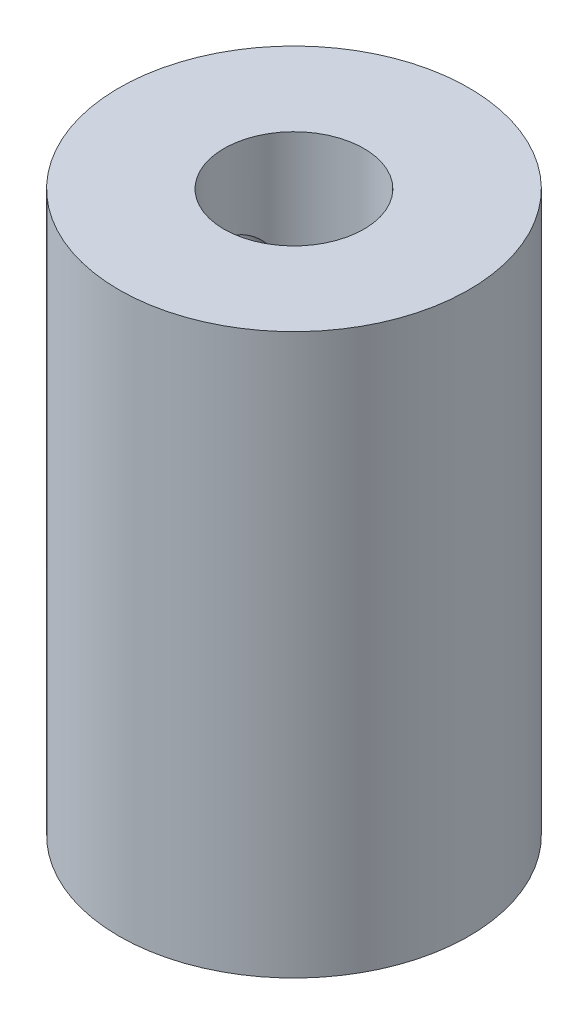
ISO-10303-21;
HEADER;
FILE_DESCRIPTION(('STEP AP214'),'2;1');
FILE_NAME('part.step','',(''),(''),'','','');
FILE_SCHEMA(('AUTOMOTIVE_DESIGN { 1 0 10303 214 1 1 1 1 }'));
ENDSEC;
DATA;
#1=APPLICATION_CONTEXT('core data for automotive mechanical design processes');
#2=APPLICATION_PROTOCOL_DEFINITION('international standard','automotive_design',2000,#1);
#3=PRODUCT_CONTEXT('',#1,'mechanical');
#4=PRODUCT('Part','Part','',(#3));
#5=PRODUCT_RELATED_PRODUCT_CATEGORY('part','',(#4));
#6=PRODUCT_DEFINITION_FORMATION('','',#4);
#7=PRODUCT_DEFINITION_CONTEXT('part definition',#1,'design');
#8=PRODUCT_DEFINITION('design','',#6,#7);
#9=PRODUCT_DEFINITION_SHAPE('','',#8);
#10=(LENGTH_UNIT() NAMED_UNIT(*) SI_UNIT(.MILLI.,.METRE.));
#11=(NAMED_UNIT(*) PLANE_ANGLE_UNIT() SI_UNIT($,.RADIAN.));
#12=(NAMED_UNIT(*) SI_UNIT($,.STERADIAN.) SOLID_ANGLE_UNIT());
#13=UNCERTAINTY_MEASURE_WITH_UNIT(LENGTH_MEASURE(1.E-05),#10,'distance_accuracy_value','');
#14=(GEOMETRIC_REPRESENTATION_CONTEXT(3) GLOBAL_UNCERTAINTY_ASSIGNED_CONTEXT((#13)) GLOBAL_UNIT_ASSIGNED_CONTEXT((#10,
#11,#12)) REPRESENTATION_CONTEXT('',''));
#15=CARTESIAN_POINT('',(0.,0.,0.));
#16=DIRECTION('',(0.,0.,1.));
#17=DIRECTION('',(1.,0.,0.));
#18=AXIS2_PLACEMENT_3D('',#15,#16,#17);
#19=CARTESIAN_POINT('',(0.,0.,0.));
#20=DIRECTION('',(0.,1.,0.));
#21=DIRECTION('',(0.,0.,1.));
#22=AXIS2_PLACEMENT_3D('',#19,#20,#21);
#23=PLANE('',#22);
#24=CARTESIAN_POINT('',(0.,0.,0.));
#25=DIRECTION('',(0.,1.,0.));
#26=DIRECTION('',(0.,0.,1.));
#27=AXIS2_PLACEMENT_3D('',#24,#25,#26);
#28=CIRCLE('',#27,5.);
#29=CARTESIAN_POINT('',(0.,0.,5.));
#30=VERTEX_POINT('',#29);
#31=EDGE_CURVE('E10',#30,#30,#28,.T.);
#32=ORIENTED_EDGE('',*,*,#31,.F.);
#33=EDGE_LOOP('',(#32));
#34=FACE_BOUND('',#33,.T.);
#35=CARTESIAN_POINT('',(0.,0.,0.));
#36=DIRECTION('',(0.,1.,0.));
#37=DIRECTION('',(0.,0.,1.));
#38=AXIS2_PLACEMENT_3D('',#35,#36,#37);
#39=CIRCLE('',#38,2.1);
#40=CARTESIAN_POINT('',(0.,0.,2.1));
#41=VERTEX_POINT('',#40);
#42=EDGE_CURVE('E43',#41,#41,#39,.T.);
#43=ORIENTED_EDGE('',*,*,#42,.T.);
#44=EDGE_LOOP('',(#43));
#45=FACE_BOUND('',#44,.T.);
#46=ADVANCED_FACE('F35',(#34,#45),#23,.F.);
#47=CARTESIAN_POINT('',(0.,8.,0.));
#48=DIRECTION('',(0.,-1.,0.));
#49=DIRECTION('',(0.,0.,-1.));
#50=AXIS2_PLACEMENT_3D('',#47,#48,#49);
#51=CYLINDRICAL_SURFACE('',#50,5.);
#52=CARTESIAN_POINT('',(-4.84122918275927,12.5,1.24999999999999));
#53=CARTESIAN_POINT('',(-4.84123050042654,12.4309746245377,1.24999803929588));
#54=CARTESIAN_POINT('',(-4.84272153006957,12.361927550661,1.24426312274865));
#55=CARTESIAN_POINT('',(-4.84850930996624,12.225816210913,1.22151156273206));
#56=CARTESIAN_POINT('',(-4.85280769310907,12.1587531227658,1.20448835337109));
#57=CARTESIAN_POINT('',(-4.86369362297984,12.0285982309065,1.15974559981597));
#58=CARTESIAN_POINT('',(-4.87027821345205,11.9655014223072,1.13203986392723));
#59=CARTESIAN_POINT('',(-4.88499096014404,11.84484457373,1.0667605706307));
#60=CARTESIAN_POINT('',(-4.89311918189251,11.7872847689599,1.02918659428034));
#61=CARTESIAN_POINT('',(-4.91020358177806,11.6780691773689,0.944354213655933));
#62=CARTESIAN_POINT('',(-4.91917298811515,11.626553199825,0.89691844385202));
#63=CARTESIAN_POINT('',(-4.93681437757649,11.5321193028198,0.794091032050328));
#64=CARTESIAN_POINT('',(-4.94548633283195,11.4892021871891,0.73869864709015));
#65=CARTESIAN_POINT('',(-4.96170207760291,11.4126122661844,0.620572600539473));
#66=CARTESIAN_POINT('',(-4.96922843700296,11.3790768059193,0.557747288097556));
#67=CARTESIAN_POINT('',(-4.98215405962992,11.3230951779235,0.427131592146378));
#68=CARTESIAN_POINT('',(-4.98755363667172,11.3006473740423,0.359341942895968));
#69=CARTESIAN_POINT('',(-4.9955237942409,11.2679260827107,0.222179379377079));
#70=CARTESIAN_POINT('',(-4.99814946922157,11.2574151778367,0.152866359774487));
#71=CARTESIAN_POINT('',(-5.00046797053649,11.2481208103622,0.0134144096313842));
#72=CARTESIAN_POINT('',(-5.00016123048352,11.2493356138952,-0.0567243972690344));
#73=CARTESIAN_POINT('',(-4.99669047476767,11.2632874251251,-0.194190308965483));
#74=CARTESIAN_POINT('',(-4.99359001170437,11.2757681625269,-0.261545269501333));
#75=CARTESIAN_POINT('',(-4.98495418262427,11.3114856350243,-0.393172809267106));
#76=CARTESIAN_POINT('',(-4.9794186869922,11.3347229426887,-0.457445224213045));
#77=CARTESIAN_POINT('',(-4.96643754850448,11.3915012853435,-0.581758379377256));
#78=CARTESIAN_POINT('',(-4.95897509847527,11.4251335223309,-0.641755637208128));
#79=CARTESIAN_POINT('',(-4.94294951904825,11.5016778395581,-0.755344527925607));
#80=CARTESIAN_POINT('',(-4.93438619826245,11.5445915342803,-0.808935043856878));
#81=CARTESIAN_POINT('',(-4.9168185688476,11.6398543709912,-0.90971754385619));
#82=CARTESIAN_POINT('',(-4.90780859762959,11.6924274461739,-0.956697098843993));
#83=CARTESIAN_POINT('',(-4.89057521758353,11.8047999867701,-1.04122046995377));
#84=CARTESIAN_POINT('',(-4.88235184552985,11.8645997897455,-1.07876384505751));
#85=CARTESIAN_POINT('',(-4.86760248415824,11.9901450170745,-1.14348516127824));
#86=CARTESIAN_POINT('',(-4.8610849186286,12.0559178651566,-1.17061195871311));
#87=CARTESIAN_POINT('',(-4.85059320069979,12.1912927340382,-1.21335702579542));
#88=CARTESIAN_POINT('',(-4.84661850405109,12.2608939319916,-1.22897775819113));
#89=CARTESIAN_POINT('',(-4.84177678019571,12.3999797507616,-1.24791481933258));
#90=CARTESIAN_POINT('',(-4.84083044546824,12.4694188966648,-1.25154523695981));
#91=CARTESIAN_POINT('',(-4.8419367174052,12.6079109682891,-1.24725849525777));
#92=CARTESIAN_POINT('',(-4.84398904800633,12.6769639289756,-1.23934239892439));
#93=CARTESIAN_POINT('',(-4.8507854097728,12.8115571324774,-1.21246273196882));
#94=CARTESIAN_POINT('',(-4.85548485117188,12.8771363632854,-1.19368203414087));
#95=CARTESIAN_POINT('',(-4.86700359135481,13.0042157289258,-1.1458090408353));
#96=CARTESIAN_POINT('',(-4.87382314124307,13.0657153795277,-1.11671552385627));
#97=CARTESIAN_POINT('',(-4.88898068546631,13.1842206389337,-1.04838533396827));
#98=CARTESIAN_POINT('',(-4.89734584303321,13.2411144200215,-1.00896087691781));
#99=CARTESIAN_POINT('',(-4.91458541535858,13.3475941814007,-0.921325366168063));
#100=CARTESIAN_POINT('',(-4.92345991364235,13.397178958325,-0.873112868506793));
#101=CARTESIAN_POINT('',(-4.94098701515803,13.4889055212855,-0.767828401230901));
#102=CARTESIAN_POINT('',(-4.94962851030918,13.5308300312744,-0.710564940664485));
#103=CARTESIAN_POINT('',(-4.96548608306867,13.6044679334756,-0.58962835336834));
#104=CARTESIAN_POINT('',(-4.9727022350198,13.6361818583041,-0.525955561196985));
#105=CARTESIAN_POINT('',(-4.98485057869157,13.688223017264,-0.394447752163859));
#106=CARTESIAN_POINT('',(-4.98979915011205,13.7086321421895,-0.326646726284848));
#107=CARTESIAN_POINT('',(-4.99692646697894,13.7377301673042,-0.188437200398507));
#108=CARTESIAN_POINT('',(-4.99910574696704,13.7464213293695,-0.118029206301552));
#109=CARTESIAN_POINT('',(-5.00042711761014,13.7517094869694,0.0213544080541591));
#110=CARTESIAN_POINT('',(-4.9996497360001,13.7486271363692,0.0903172837075422));
#111=CARTESIAN_POINT('',(-4.99532370571779,13.7311902158821,0.226709370518425));
#112=CARTESIAN_POINT('',(-4.99177513946369,13.7168359812336,0.294138627226108));
#113=CARTESIAN_POINT('',(-4.98231791067453,13.6774347252863,0.425213794556019));
#114=CARTESIAN_POINT('',(-4.97642205628333,13.6524456833567,0.488878118226273));
#115=CARTESIAN_POINT('',(-4.9628911114173,13.5925367762258,0.611146316301834));
#116=CARTESIAN_POINT('',(-4.9552558017217,13.557615659163,0.669749551581312));
#117=CARTESIAN_POINT('',(-4.93884062101666,13.4778559575037,0.781752410529871));
#118=CARTESIAN_POINT('',(-4.93003771182014,13.4327998213658,0.834993735375727));
#119=CARTESIAN_POINT('',(-4.91238311316553,13.3344714350327,0.933268775339065));
#120=CARTESIAN_POINT('',(-4.90353141190695,13.2811971048776,0.978300406335232));
#121=CARTESIAN_POINT('',(-4.88659344825685,13.1667482322483,1.05970253309903));
#122=CARTESIAN_POINT('',(-4.87852454662356,13.1054448457342,1.09589577430818));
#123=CARTESIAN_POINT('',(-4.8642994443827,12.9774306375966,1.15740862076958));
#124=CARTESIAN_POINT('',(-4.85814185308379,12.9107237923666,1.18273613719964));
#125=CARTESIAN_POINT('',(-4.84939885924729,12.7867787352166,1.21802816070679));
#126=CARTESIAN_POINT('',(-4.84635828750683,12.7301335445202,1.22999146324422));
#127=CARTESIAN_POINT('',(-4.84227298231965,12.61566391375,1.24597786571658));
#128=CARTESIAN_POINT('',(-4.84122807862454,12.5578395746937,1.25000164296522));
#129=CARTESIAN_POINT('',(-4.84122918275927,12.5,1.24999999999999));
#130=B_SPLINE_CURVE_WITH_KNOTS('',3,(#52,#53,#54,#55,#56,#57,#58,#59,#60,#61,#62,#63,#64,#65,
#66,#67,#68,#69,#70,#71,#72,#73,#74,#75,#76,#77,#78,#79,#80,#81,#82,#83,#84,#85,#86,#87,#88,#89,
#90,#91,#92,#93,#94,#95,#96,#97,#98,#99,#100,#101,#102,#103,#104,#105,#106,#107,#108,#109,#110,
#111,#112,#113,#114,#115,#116,#117,#118,#119,#120,#121,#122,#123,#124,#125,#126,#127,#128,#129),
.UNSPECIFIED.,.T.,.F.,(4,2,2,2,2,2,2,2,2,2,2,2,2,2,2,2,2,2,2,2,2,2,2,2,2,2,2,2,2,2,2,2,2,2,2,2,
2,2,4),(0.,0.206863720868068,0.413847870714331,0.620565363583007,0.827291633777387,
1.03811977096488,1.24896760739933,1.46275748198959,1.67651579923545,1.88594375497672,
2.09534074333009,2.30009131344472,2.50485278362392,2.71146437127221,2.91811192734455,
3.13035233285954,3.34260265599899,3.55588216004199,3.76911600064772,3.97671787380857,
4.18430063591899,4.38848702504601,4.59269760710706,4.80091422929576,5.0091650944252,
5.22262665482657,5.43607707859774,5.64796036403462,5.85980274454516,6.06591723063725,
6.27202558688487,6.47702438279852,6.68204902869033,6.89198548291032,7.10197515782751,
7.31588238642335,7.52963360683306,7.70298913588661,7.87632987549756),.UNSPECIFIED.);
#131=CARTESIAN_POINT('',(-4.84122918275927,12.5,1.24999999999999));
#132=VERTEX_POINT('',#131);
#133=EDGE_CURVE('E112',#132,#132,#130,.T.);
#134=ORIENTED_EDGE('',*,*,#133,.T.);
#135=EDGE_LOOP('',(#134));
#136=FACE_BOUND('',#135,.T.);
#137=CARTESIAN_POINT('',(-4.84122918275927,3.5,1.24999999999999));
#138=CARTESIAN_POINT('',(-4.84123050042654,3.4309746245377,1.24999803929588));
#139=CARTESIAN_POINT('',(-4.84272153006957,3.361927550661,1.24426312274865));
#140=CARTESIAN_POINT('',(-4.84850930996624,3.22581621091298,1.22151156273206));
#141=CARTESIAN_POINT('',(-4.85280769310907,3.15875312276584,1.20448835337109));
#142=CARTESIAN_POINT('',(-4.86369362297984,3.02859823090648,1.15974559981597));
#143=CARTESIAN_POINT('',(-4.87027821345204,2.96550142230717,1.13203986392723));
#144=CARTESIAN_POINT('',(-4.88499096014404,2.84484457373004,1.0667605706307));
#145=CARTESIAN_POINT('',(-4.89311918189251,2.78728476895989,1.02918659428034));
#146=CARTESIAN_POINT('',(-4.91020358177806,2.6780691773689,0.944354213655933));
#147=CARTESIAN_POINT('',(-4.91917298811515,2.62655319982498,0.896918443852021));
#148=CARTESIAN_POINT('',(-4.93681437757649,2.53211930281983,0.794091032050329));
#149=CARTESIAN_POINT('',(-4.94548633283195,2.48920218718913,0.738698647090151));
#150=CARTESIAN_POINT('',(-4.96170207760291,2.41261226618437,0.620572600539475));
#151=CARTESIAN_POINT('',(-4.96922843700296,2.37907680591927,0.557747288097558));
#152=CARTESIAN_POINT('',(-4.98215405962992,2.32309517792346,0.42713159214638));
#153=CARTESIAN_POINT('',(-4.98755363667172,2.30064737404225,0.359341942895969));
#154=CARTESIAN_POINT('',(-4.9955237942409,2.26792608271071,0.22217937937708));
#155=CARTESIAN_POINT('',(-4.99814946922157,2.25741517783672,0.152866359774488));
#156=CARTESIAN_POINT('',(-5.00046797053649,2.24812081036223,0.0134144096313855));
#157=CARTESIAN_POINT('',(-5.00016123048352,2.24933561389521,-0.056724397269033));
#158=CARTESIAN_POINT('',(-4.99669047476767,2.26328742512508,-0.194190308965482));
#159=CARTESIAN_POINT('',(-4.99359001170437,2.27576816252693,-0.261545269501331));
#160=CARTESIAN_POINT('',(-4.98495418262427,2.31148563502426,-0.393172809267104));
#161=CARTESIAN_POINT('',(-4.9794186869922,2.33472294268871,-0.457445224213044));
#162=CARTESIAN_POINT('',(-4.96643754850448,2.39150128534354,-0.581758379377254));
#163=CARTESIAN_POINT('',(-4.95897509847527,2.42513352233088,-0.641755637208126));
#164=CARTESIAN_POINT('',(-4.94294951904825,2.50167783955813,-0.755344527925606));
#165=CARTESIAN_POINT('',(-4.93438619826245,2.54459153428031,-0.808935043856877));
#166=CARTESIAN_POINT('',(-4.9168185688476,2.63985437099119,-0.909717543856189));
#167=CARTESIAN_POINT('',(-4.90780859762959,2.69242744617389,-0.956697098843993));
#168=CARTESIAN_POINT('',(-4.89057521758353,2.80479998677013,-1.04122046995377));
#169=CARTESIAN_POINT('',(-4.88235184552985,2.8645997897455,-1.07876384505751));
#170=CARTESIAN_POINT('',(-4.86760248415824,2.99014501707449,-1.14348516127824));
#171=CARTESIAN_POINT('',(-4.8610849186286,3.0559178651566,-1.17061195871311));
#172=CARTESIAN_POINT('',(-4.85059320069979,3.19129273403823,-1.21335702579542));
#173=CARTESIAN_POINT('',(-4.84661850405109,3.26089393199157,-1.22897775819113));
#174=CARTESIAN_POINT('',(-4.84177678019571,3.39997975076156,-1.24791481933258));
#175=CARTESIAN_POINT('',(-4.84083044546824,3.46941889666481,-1.25154523695981));
#176=CARTESIAN_POINT('',(-4.8419367174052,3.60791096828908,-1.24725849525777));
#177=CARTESIAN_POINT('',(-4.84398904800633,3.67696392897562,-1.23934239892439));
#178=CARTESIAN_POINT('',(-4.8507854097728,3.81155713247735,-1.21246273196882));
#179=CARTESIAN_POINT('',(-4.85548485117188,3.87713636328542,-1.19368203414086));
#180=CARTESIAN_POINT('',(-4.86700359135481,4.00421572892584,-1.1458090408353));
#181=CARTESIAN_POINT('',(-4.87382314124307,4.06571537952767,-1.11671552385627));
#182=CARTESIAN_POINT('',(-4.88898068546631,4.18422063893367,-1.04838533396827));
#183=CARTESIAN_POINT('',(-4.89734584303321,4.24111442002155,-1.00896087691781));
#184=CARTESIAN_POINT('',(-4.91458541535858,4.34759418140067,-0.921325366168063));
#185=CARTESIAN_POINT('',(-4.92345991364235,4.39717895832503,-0.873112868506793));
#186=CARTESIAN_POINT('',(-4.94098701515803,4.48890552128547,-0.767828401230902));
#187=CARTESIAN_POINT('',(-4.94962851030918,4.5308300312744,-0.710564940664485));
#188=CARTESIAN_POINT('',(-4.96548608306867,4.60446793347562,-0.58962835336834));
#189=CARTESIAN_POINT('',(-4.9727022350198,4.6361818583041,-0.525955561196985));
#190=CARTESIAN_POINT('',(-4.98485057869157,4.68822301726396,-0.394447752163859));
#191=CARTESIAN_POINT('',(-4.98979915011205,4.70863214218952,-0.326646726284848));
#192=CARTESIAN_POINT('',(-4.99692646697894,4.7377301673042,-0.188437200398507));
#193=CARTESIAN_POINT('',(-4.99910574696704,4.74642132936952,-0.118029206301552));
#194=CARTESIAN_POINT('',(-5.00042711761014,4.75170948696941,0.0213544080541592));
#195=CARTESIAN_POINT('',(-4.9996497360001,4.74862713636923,0.0903172837075423));
#196=CARTESIAN_POINT('',(-4.9953237057178,4.73119021588208,0.226709370518425));
#197=CARTESIAN_POINT('',(-4.99177513946369,4.71683598123361,0.294138627226108));
#198=CARTESIAN_POINT('',(-4.98231791067453,4.67743472528633,0.425213794556019));
#199=CARTESIAN_POINT('',(-4.97642205628333,4.65244568335671,0.488878118226273));
#200=CARTESIAN_POINT('',(-4.9628911114173,4.59253677622584,0.611146316301834));
#201=CARTESIAN_POINT('',(-4.9552558017217,4.55761565916304,0.669749551581312));
#202=CARTESIAN_POINT('',(-4.93884062101666,4.47785595750365,0.781752410529871));
#203=CARTESIAN_POINT('',(-4.93003771182014,4.43279982136577,0.834993735375727));
#204=CARTESIAN_POINT('',(-4.91238311316553,4.33447143503275,0.933268775339065));
#205=CARTESIAN_POINT('',(-4.90353141190695,4.28119710487761,0.978300406335233));
#206=CARTESIAN_POINT('',(-4.88659344825685,4.16674823224833,1.05970253309903));
#207=CARTESIAN_POINT('',(-4.87852454662356,4.10544484573421,1.09589577430818));
#208=CARTESIAN_POINT('',(-4.8642994443827,3.97743063759662,1.15740862076958));
#209=CARTESIAN_POINT('',(-4.85814185308379,3.91072379236657,1.18273613719964));
#210=CARTESIAN_POINT('',(-4.84939885924729,3.7867787352166,1.21802816070679));
#211=CARTESIAN_POINT('',(-4.84635828750683,3.73013354452017,1.22999146324422));
#212=CARTESIAN_POINT('',(-4.84227298231965,3.61566391375004,1.24597786571658));
#213=CARTESIAN_POINT('',(-4.84122807862454,3.55783957469367,1.25000164296523));
#214=CARTESIAN_POINT('',(-4.84122918275927,3.5,1.24999999999999));
#215=B_SPLINE_CURVE_WITH_KNOTS('',3,(#137,#138,#139,#140,#141,#142,#143,#144,#145,#146,#147,
#148,#149,#150,#151,#152,#153,#154,#155,#156,#157,#158,#159,#160,#161,#162,#163,#164,#165,#166,
#167,#168,#169,#170,#171,#172,#173,#174,#175,#176,#177,#178,#179,#180,#181,#182,#183,#184,#185,
#186,#187,#188,#189,#190,#191,#192,#193,#194,#195,#196,#197,#198,#199,#200,#201,#202,#203,#204,
#205,#206,#207,#208,#209,#210,#211,#212,#213,#214),.UNSPECIFIED.,.T.,.F.,(4,2,2,2,2,2,2,2,2,2,2,
2,2,2,2,2,2,2,2,2,2,2,2,2,2,2,2,2,2,2,2,2,2,2,2,2,2,2,4),(0.,0.206863720868067,
0.413847870714331,0.620565363583008,0.827291633777388,1.03811977096487,1.24896760739933,
1.46275748198959,1.67651579923545,1.88594375497672,2.09534074333009,2.30009131344472,
2.50485278362392,2.71146437127221,2.91811192734455,3.13035233285954,3.34260265599899,
3.55588216004199,3.76911600064772,3.97671787380856,4.18430063591899,4.38848702504601,
4.59269760710706,4.80091422929576,5.00916509442519,5.22262665482657,5.43607707859774,
5.64796036403462,5.85980274454516,6.06591723063725,6.27202558688487,6.47702438279852,
6.68204902869033,6.89198548291032,7.10197515782751,7.31588238642335,7.52963360683306,
7.70298913588661,7.87632987549756),.UNSPECIFIED.);
#216=CARTESIAN_POINT('',(-4.84122918275927,3.5,1.24999999999999));
#217=VERTEX_POINT('',#216);
#218=EDGE_CURVE('E60',#217,#217,#215,.T.);
#219=ORIENTED_EDGE('',*,*,#218,.T.);
#220=EDGE_LOOP('',(#219));
#221=FACE_BOUND('',#220,.T.);
#222=ORIENTED_EDGE('',*,*,#31,.T.);
#223=EDGE_LOOP('',(#222));
#224=FACE_BOUND('',#223,.T.);
#225=CARTESIAN_POINT('',(0.,16.,0.));
#226=DIRECTION('',(0.,1.,0.));
#227=DIRECTION('',(0.,0.,1.));
#228=AXIS2_PLACEMENT_3D('',#225,#226,#227);
#229=CIRCLE('',#228,5.);
#230=CARTESIAN_POINT('',(0.,16.,5.));
#231=VERTEX_POINT('',#230);
#232=EDGE_CURVE('E51',#231,#231,#229,.T.);
#233=ORIENTED_EDGE('',*,*,#232,.F.);
#234=EDGE_LOOP('',(#233));
#235=FACE_BOUND('',#234,.T.);
#236=ADVANCED_FACE('F37',(#136,#221,#224,#235),#51,.T.);
#237=CARTESIAN_POINT('',(0.,8.,0.));
#238=DIRECTION('',(0.,-1.,0.));
#239=DIRECTION('',(0.,0.,-1.));
#240=AXIS2_PLACEMENT_3D('',#237,#238,#239);
#241=CYLINDRICAL_SURFACE('',#240,2.1);
#242=CARTESIAN_POINT('',(-1.68745370306862,3.5,1.24999999999999));
#243=CARTESIAN_POINT('',(-1.68745034276093,3.43698076884238,1.25000239170536));
#244=CARTESIAN_POINT('',(-1.69103664835489,3.37397345633133,1.24520529451589));
#245=CARTESIAN_POINT('',(-1.70474679595877,3.25006747092614,1.22636400209901));
#246=CARTESIAN_POINT('',(-1.71487738194761,3.18917104161608,1.21231026747485));
#247=CARTESIAN_POINT('',(-1.74005212591714,3.07154695601474,1.17588198139133));
#248=CARTESIAN_POINT('',(-1.75506137659343,3.01479309180688,1.15356639107476));
#249=CARTESIAN_POINT('',(-1.78823768182834,2.90586997732522,1.10143511508199));
#250=CARTESIAN_POINT('',(-1.80640570616566,2.85370214244077,1.07161712482469));
#251=CARTESIAN_POINT('',(-1.84649110482346,2.74855463090973,1.00115043304533));
#252=CARTESIAN_POINT('',(-1.86859670954316,2.69623012668454,0.959630993855094));
#253=CARTESIAN_POINT('',(-1.91255543772763,2.59874449136728,0.868725768563933));
#254=CARTESIAN_POINT('',(-1.93440836418131,2.55358864079904,0.819334236951251));
#255=CARTESIAN_POINT('',(-1.97814131824754,2.46700254614124,0.70775126566869));
#256=CARTESIAN_POINT('',(-1.99977999560899,2.4264707846945,0.64475866964404));
#257=CARTESIAN_POINT('',(-2.03797831640919,2.35688937429258,0.511315653757196));
#258=CARTESIAN_POINT('',(-2.05454253689692,2.32782937119289,0.440872032182753));
#259=CARTESIAN_POINT('',(-2.07932594428391,2.28493961512691,0.301543066903673));
#260=CARTESIAN_POINT('',(-2.08818462949669,2.26993232900922,0.233136879738541));
#261=CARTESIAN_POINT('',(-2.09903519500877,2.25159841527774,0.0942622194112527));
#262=CARTESIAN_POINT('',(-2.10103339220748,2.24826104236034,0.0237957036670243));
#263=CARTESIAN_POINT('',(-2.09813230682546,2.2531405925709,-0.107922091393411));
#264=CARTESIAN_POINT('',(-2.09404538379903,2.25999654600534,-0.169248048248891));
#265=CARTESIAN_POINT('',(-2.0808047977609,2.28248966188987,-0.289691993214681));
#266=CARTESIAN_POINT('',(-2.0716507599766,2.2981274738627,-0.348809817662402));
#267=CARTESIAN_POINT('',(-2.04899680484598,2.33761019887039,-0.463756390686285));
#268=CARTESIAN_POINT('',(-2.03546961141652,2.36150668895764,-0.519561823173573));
#269=CARTESIAN_POINT('',(-2.00515802585832,2.41663109604052,-0.62644354310846));
#270=CARTESIAN_POINT('',(-1.98837276841128,2.44786096119089,-0.677518568859076));
#271=CARTESIAN_POINT('',(-1.95063185016377,2.52093984162109,-0.779972276402234));
#272=CARTESIAN_POINT('',(-1.92941771348558,2.56360845337675,-0.830670595039268));
#273=CARTESIAN_POINT('',(-1.88620283074345,2.65623421398981,-0.924618522714001));
#274=CARTESIAN_POINT('',(-1.86420106723209,2.70620106745055,-0.967858044033168));
#275=CARTESIAN_POINT('',(-1.81898477622687,2.81870921260337,-1.05059846125122));
#276=CARTESIAN_POINT('',(-1.79591463396037,2.88203355416738,-1.08912301738904));
#277=CARTESIAN_POINT('',(-1.75443308799016,3.01571009420015,-1.15476446111589));
#278=CARTESIAN_POINT('',(-1.7360131601126,3.08604909907314,-1.18190228277606));
#279=CARTESIAN_POINT('',(-1.71064674722225,3.21411487732039,-1.21821699755716));
#280=CARTESIAN_POINT('',(-1.70199591964791,3.27071839180981,-1.23016347646416));
#281=CARTESIAN_POINT('',(-1.6903673259053,3.38558345565386,-1.24609814114003));
#282=CARTESIAN_POINT('',(-1.68738316760645,3.44384306148413,-1.25009529416871));
#283=CARTESIAN_POINT('',(-1.68752691741201,3.56041016349112,-1.24990108934575));
#284=CARTESIAN_POINT('',(-1.69066238296346,3.61871762988288,-1.24569960656654));
#285=CARTESIAN_POINT('',(-1.70258759488903,3.73362513941889,-1.22934677297278));
#286=CARTESIAN_POINT('',(-1.71138175763188,3.79022381277192,-1.21718921265711));
#287=CARTESIAN_POINT('',(-1.73347146455646,3.90043800757667,-1.1855147361648));
#288=CARTESIAN_POINT('',(-1.74677289397925,3.95404952150692,-1.16598819433116));
#289=CARTESIAN_POINT('',(-1.77644476006853,4.05741606750048,-1.12026143452764));
#290=CARTESIAN_POINT('',(-1.79281636922901,4.10716961592161,-1.09405866554754));
#291=CARTESIAN_POINT('',(-1.83029976738453,4.21079624141949,-1.0303388887509));
#292=CARTESIAN_POINT('',(-1.85173649059899,4.26382495867925,-0.991637973400154));
#293=CARTESIAN_POINT('',(-1.89488021916018,4.36317742776078,-0.90648300337352));
#294=CARTESIAN_POINT('',(-1.91658746008854,4.40949481650766,-0.860021679648029));
#295=CARTESIAN_POINT('',(-1.96102224478626,4.49992356816242,-0.753727848369373));
#296=CARTESIAN_POINT('',(-1.98353959676391,4.54303999463544,-0.692950483156723));
#297=CARTESIAN_POINT('',(-2.02410025456373,4.61825063317195,-0.563561688748349));
#298=CARTESIAN_POINT('',(-2.04214664926579,4.6503524608997,-0.494955716285497));
#299=CARTESIAN_POINT('',(-2.07051819156576,4.69996979646116,-0.357111097841917));
#300=CARTESIAN_POINT('',(-2.08131870797545,4.7183943922962,-0.288301009307307));
#301=CARTESIAN_POINT('',(-2.09597346751215,4.74326559821292,-0.147852772792833));
#302=CARTESIAN_POINT('',(-2.09983526574944,4.74972523638102,-0.076217787647324));
#303=CARTESIAN_POINT('',(-2.10013390576013,4.75022323144045,0.0577119901697103));
#304=CARTESIAN_POINT('',(-2.09747404829512,4.7457727425383,0.120005553898401));
#305=CARTESIAN_POINT('',(-2.08682788032037,4.7277637196305,0.24278552974218));
#306=CARTESIAN_POINT('',(-2.07884146621269,4.714205008476,0.303271906684791));
#307=CARTESIAN_POINT('',(-2.05839790557038,4.67885781766103,0.420088871922343));
#308=CARTESIAN_POINT('',(-2.04599926911538,4.6571768568535,0.476462730954941));
#309=CARTESIAN_POINT('',(-2.01771031042448,4.6063901393996,0.584793343285843));
#310=CARTESIAN_POINT('',(-2.00181918180766,4.57728266779729,0.636749072634311));
#311=CARTESIAN_POINT('',(-1.96582330806447,4.50890916258663,0.740874016461115));
#312=CARTESIAN_POINT('',(-1.94544803303791,4.46888142610657,0.792448498803117));
#313=CARTESIAN_POINT('',(-1.90347784737556,4.38158619945922,0.888554053336322));
#314=CARTESIAN_POINT('',(-1.88188157186534,4.33431050208498,0.933077023095575));
#315=CARTESIAN_POINT('',(-1.83668242030002,4.22701943708837,1.01943750865135));
#316=CARTESIAN_POINT('',(-1.8131604502897,4.16615199727682,1.06026705449078));
#317=CARTESIAN_POINT('',(-1.76985422427021,4.03717430192661,1.13108089433831));
#318=CARTESIAN_POINT('',(-1.75006720875891,3.96906945222427,1.16107321033153));
#319=CARTESIAN_POINT('',(-1.71927958106148,3.83493879093721,1.20612794207762));
#320=CARTESIAN_POINT('',(-1.70754734237367,3.76952171652424,1.22247828909728));
#321=CARTESIAN_POINT('',(-1.69164340542759,3.63606163500429,1.24440278068201));
#322=CARTESIAN_POINT('',(-1.68745733023359,3.56802387408161,1.24999741835846));
#323=CARTESIAN_POINT('',(-1.68745370306862,3.5,1.24999999999999));
#324=B_SPLINE_CURVE_WITH_KNOTS('',3,(#242,#243,#244,#245,#246,#247,#248,#249,#250,#251,#252,
#253,#254,#255,#256,#257,#258,#259,#260,#261,#262,#263,#264,#265,#266,#267,#268,#269,#270,#271,
#272,#273,#274,#275,#276,#277,#278,#279,#280,#281,#282,#283,#284,#285,#286,#287,#288,#289,#290,
#291,#292,#293,#294,#295,#296,#297,#298,#299,#300,#301,#302,#303,#304,#305,#306,#307,#308,#309,
#310,#311,#312,#313,#314,#315,#316,#317,#318,#319,#320,#321,#322,#323),.UNSPECIFIED.,.T.,.F.,(4,
2,2,2,2,2,2,2,2,2,2,2,2,2,2,2,2,2,2,2,2,2,2,2,2,2,2,2,2,2,2,2,2,2,2,2,2,2,2,2,4),(0.,
0.188772639417388,0.377740122865093,0.565384239535801,0.753086067095713,0.963334171309886,
1.17373643553012,1.40638111617897,1.63881533436262,1.84933729080649,2.05966535387399,
2.24431343623344,2.42897517731076,2.61481165375326,2.80069755472557,3.00859735467036,
3.2167761628458,3.44850612430267,3.6798081724621,3.85453493733673,4.02906448913152,
4.20380971307996,4.37869148381781,4.55380248725223,4.72898050183363,4.93535623614865,
5.14192637463611,5.3742498846387,5.60641243733638,5.82126513335366,6.03588374841853,
6.22249091064396,6.40910170235928,6.59332482551201,6.77759052867908,6.98195306204523,
7.18654873759303,7.4163706956808,7.64602218367842,7.85017547961908,8.05393941037325),.UNSPECIFIED.);
#325=CARTESIAN_POINT('',(-1.68745370306862,3.5,1.24999999999999));
#326=VERTEX_POINT('',#325);
#327=EDGE_CURVE('E69',#326,#326,#324,.T.);
#328=ORIENTED_EDGE('',*,*,#327,.F.);
#329=EDGE_LOOP('',(#328));
#330=FACE_BOUND('',#329,.T.);
#331=CARTESIAN_POINT('',(0.,8.,0.));
#332=DIRECTION('',(0.,1.,0.));
#333=DIRECTION('',(0.,0.,1.));
#334=AXIS2_PLACEMENT_3D('',#331,#332,#333);
#335=CIRCLE('',#334,2.1);
#336=CARTESIAN_POINT('',(0.,8.,2.1));
#337=VERTEX_POINT('',#336);
#338=EDGE_CURVE('E47',#337,#337,#335,.T.);
#339=ORIENTED_EDGE('',*,*,#338,.T.);
#340=EDGE_LOOP('',(#339));
#341=FACE_BOUND('',#340,.T.);
#342=ORIENTED_EDGE('',*,*,#42,.F.);
#343=EDGE_LOOP('',(#342));
#344=FACE_BOUND('',#343,.T.);
#345=ADVANCED_FACE('F97',(#330,#341,#344),#241,.F.);
#346=CARTESIAN_POINT('',(0.,8.,0.));
#347=DIRECTION('',(0.,1.,0.));
#348=DIRECTION('',(0.,0.,1.));
#349=AXIS2_PLACEMENT_3D('',#346,#347,#348);
#350=PLANE('',#349);
#351=CARTESIAN_POINT('',(0.,8.,0.));
#352=DIRECTION('',(0.,1.,0.));
#353=DIRECTION('',(0.,0.,1.));
#354=AXIS2_PLACEMENT_3D('',#351,#352,#353);
#355=CIRCLE('',#354,2.);
#356=CARTESIAN_POINT('',(0.,8.,2.));
#357=VERTEX_POINT('',#356);
#358=EDGE_CURVE('E57',#357,#357,#355,.T.);
#359=ORIENTED_EDGE('',*,*,#358,.T.);
#360=EDGE_LOOP('',(#359));
#361=FACE_BOUND('',#360,.T.);
#362=ORIENTED_EDGE('',*,*,#338,.F.);
#363=EDGE_LOOP('',(#362));
#364=FACE_BOUND('',#363,.T.);
#365=ADVANCED_FACE('F93',(#361,#364),#350,.F.);
#366=CARTESIAN_POINT('',(0.,16.,0.));
#367=DIRECTION('',(0.,1.,0.));
#368=DIRECTION('',(0.,0.,1.));
#369=AXIS2_PLACEMENT_3D('',#366,#367,#368);
#370=PLANE('',#369);
#371=ORIENTED_EDGE('',*,*,#232,.T.);
#372=EDGE_LOOP('',(#371));
#373=FACE_BOUND('',#372,.T.);
#374=CARTESIAN_POINT('',(0.,16.,0.));
#375=DIRECTION('',(0.,1.,0.));
#376=DIRECTION('',(0.,0.,1.));
#377=AXIS2_PLACEMENT_3D('',#374,#375,#376);
#378=CIRCLE('',#377,2.);
#379=CARTESIAN_POINT('',(0.,16.,2.));
#380=VERTEX_POINT('',#379);
#381=EDGE_CURVE('E56',#380,#380,#378,.T.);
#382=ORIENTED_EDGE('',*,*,#381,.F.);
#383=EDGE_LOOP('',(#382));
#384=FACE_BOUND('',#383,.T.);
#385=ADVANCED_FACE('F89',(#373,#384),#370,.T.);
#386=CARTESIAN_POINT('',(0.,16.,0.));
#387=DIRECTION('',(0.,-1.,0.));
#388=DIRECTION('',(0.,0.,-1.));
#389=AXIS2_PLACEMENT_3D('',#386,#387,#388);
#390=CYLINDRICAL_SURFACE('',#389,2.);
#391=CARTESIAN_POINT('',(-1.5612494995996,12.5,1.24999999999999));
#392=CARTESIAN_POINT('',(-1.56125800072559,12.4378797181971,1.24999462210484));
#393=CARTESIAN_POINT('',(-1.56502642708837,12.3756621646297,1.24532693849665));
#394=CARTESIAN_POINT('',(-1.57943717205478,12.2533236799206,1.22698950832934));
#395=CARTESIAN_POINT('',(-1.59009816464115,12.1932089136348,1.2132953043055));
#396=CARTESIAN_POINT('',(-1.61650085329042,12.0772176773012,1.1778807391187));
#397=CARTESIAN_POINT('',(-1.63219837418034,12.0213093913182,1.15622993332784));
#398=CARTESIAN_POINT('',(-1.66682950714433,11.9139911383618,1.10571945561923));
#399=CARTESIAN_POINT('',(-1.68576320748676,11.8625812941435,1.07685958706091));
#400=CARTESIAN_POINT('',(-1.72779611374712,11.758134845523,1.00823937928364));
#401=CARTESIAN_POINT('',(-1.75111338227347,11.7058052591674,0.967536093692498));
#402=CARTESIAN_POINT('',(-1.79752820854877,11.608117300855,0.878308664496875));
#403=CARTESIAN_POINT('',(-1.82062555863329,11.5627650027161,0.829777781297408));
#404=CARTESIAN_POINT('',(-1.86729453891009,11.4748964148519,0.719186665258487));
#405=CARTESIAN_POINT('',(-1.8905872224145,11.4333823318957,0.656200568910552));
#406=CARTESIAN_POINT('',(-1.9318323169914,11.3618747952368,0.522404070837313));
#407=CARTESIAN_POINT('',(-1.94979001179838,11.3318699342488,0.451601506478239));
#408=CARTESIAN_POINT('',(-1.97669841318201,11.2875176893929,0.311776878362017));
#409=CARTESIAN_POINT('',(-1.98637922422038,11.2718885836031,0.24330563604724));
#410=CARTESIAN_POINT('',(-1.99850544379202,11.2523679303566,0.104105100662263));
#411=CARTESIAN_POINT('',(-2.00095845843657,11.2484640438795,0.0333782605640267));
#412=CARTESIAN_POINT('',(-1.99852909107528,11.2523556892776,-0.0980658284213398));
#413=CARTESIAN_POINT('',(-1.99458699811902,11.2586513763009,-0.158852523273785));
#414=CARTESIAN_POINT('',(-1.98145272261225,11.2798669843633,-0.278306645903668));
#415=CARTESIAN_POINT('',(-1.97226014325117,11.2947875572375,-0.336973913146973));
#416=CARTESIAN_POINT('',(-1.94938133614675,11.3326037750971,-0.450889117077071));
#417=CARTESIAN_POINT('',(-1.93568361673912,11.3555198240486,-0.506127875493231));
#418=CARTESIAN_POINT('',(-1.90485632889331,11.40846875526,-0.61201922046938));
#419=CARTESIAN_POINT('',(-1.88772597874226,11.4385032588906,-0.662670758559998));
#420=CARTESIAN_POINT('',(-1.84893224750793,11.5090281653294,-0.764713515567039));
#421=CARTESIAN_POINT('',(-1.82697004307144,11.5503546267423,-0.815412344918947));
#422=CARTESIAN_POINT('',(-1.78195462752237,11.6401323802234,-0.909598595905495));
#423=CARTESIAN_POINT('',(-1.75889986449171,11.6885940264466,-0.953075338789628));
#424=CARTESIAN_POINT('',(-1.71071442112196,11.7987056229061,-1.03735445892931));
#425=CARTESIAN_POINT('',(-1.68570581533195,11.8612513808503,-1.07706615479946));
#426=CARTESIAN_POINT('',(-1.640141390954,11.9936461197734,-1.14526153203308));
#427=CARTESIAN_POINT('',(-1.6195774019168,12.0634813439554,-1.17376589603357));
#428=CARTESIAN_POINT('',(-1.59091876567121,12.1897694028879,-1.21218566853166));
#429=CARTESIAN_POINT('',(-1.58096704305273,12.2449109626377,-1.2250184172172));
#430=CARTESIAN_POINT('',(-1.56679138875766,12.3571151887489,-1.24310168537523));
#431=CARTESIAN_POINT('',(-1.56255963237429,12.4141751210399,-1.24836256353274));
#432=CARTESIAN_POINT('',(-1.56046133530165,12.5287286805403,-1.25098535954507));
#433=CARTESIAN_POINT('',(-1.56260938140436,12.5862230013658,-1.24832917576576));
#434=CARTESIAN_POINT('',(-1.57296042862705,12.6997805810316,-1.23525733555987));
#435=CARTESIAN_POINT('',(-1.58116844404657,12.7558426149629,-1.22483525320261));
#436=CARTESIAN_POINT('',(-1.60230060601958,12.8642183838658,-1.19704935724829));
#437=CARTESIAN_POINT('',(-1.61514477937172,12.9165786733315,-1.17980280626787));
#438=CARTESIAN_POINT('',(-1.64415573440842,13.017787334557,-1.13902451938522));
#439=CARTESIAN_POINT('',(-1.66032369489909,13.0666344520245,-1.1154905527142));
#440=CARTESIAN_POINT('',(-1.69787203988937,13.169306039177,-1.05765376772319));
#441=CARTESIAN_POINT('',(-1.7196587573829,13.2223075412493,-1.0221537381422));
#442=CARTESIAN_POINT('',(-1.76393958000712,13.3221850524392,-0.943690263224852));
#443=CARTESIAN_POINT('',(-1.78643439903355,13.369054616978,-0.900719074496589));
#444=CARTESIAN_POINT('',(-1.83383164018973,13.4629832462432,-0.800380659499182));
#445=CARTESIAN_POINT('',(-1.85854204787598,13.5088685570077,-0.741809949714151));
#446=CARTESIAN_POINT('',(-1.90384248965,13.5900686518759,-0.616299987869565));
#447=CARTESIAN_POINT('',(-1.92443445329133,13.6253883899736,-0.54936467874865));
#448=CARTESIAN_POINT('',(-1.95809255957562,13.6819949912026,-0.412925900636588));
#449=CARTESIAN_POINT('',(-1.9715348458918,13.7039942064708,-0.343814822544508));
#450=CARTESIAN_POINT('',(-1.9910701008804,13.7357266686811,-0.201860998884736));
#451=CARTESIAN_POINT('',(-1.99717323933003,13.7454768897611,-0.129023563238357));
#452=CARTESIAN_POINT('',(-2.00096685748559,13.7515465200388,0.00659907199682118));
#453=CARTESIAN_POINT('',(-1.99976600623617,13.749635776787,0.0692812975954825));
#454=CARTESIAN_POINT('',(-1.99160739958772,13.7365383250257,0.193279811091733));
#455=CARTESIAN_POINT('',(-1.98464990541518,13.7253520374242,0.25459616084075));
#456=CARTESIAN_POINT('',(-1.9659610468898,13.6948395251234,0.372043294685532));
#457=CARTESIAN_POINT('',(-1.95440367471701,13.6758091601268,0.428280180678315));
#458=CARTESIAN_POINT('',(-1.92744968677265,13.6304400718359,0.53671436911132));
#459=CARTESIAN_POINT('',(-1.91205242331405,13.6041001155244,0.588910988118244));
#460=CARTESIAN_POINT('',(-1.87675342239824,13.5418394210088,0.693656737470671));
#461=CARTESIAN_POINT('',(-1.85655002466956,13.505208018681,0.745680127162216));
#462=CARTESIAN_POINT('',(-1.81433640456237,13.4249233696673,0.843216608355418));
#463=CARTESIAN_POINT('',(-1.7923241573062,13.381262199754,0.888722243055233));
#464=CARTESIAN_POINT('',(-1.74500415099525,13.2808837376967,0.978723601300808));
#465=CARTESIAN_POINT('',(-1.71967871446313,13.2231916548231,1.02212829873816));
#466=CARTESIAN_POINT('',(-1.67174821497037,13.1003553339899,1.09877325005744));
#467=CARTESIAN_POINT('',(-1.64914165167051,13.0352152450924,1.132019125571));
#468=CARTESIAN_POINT('',(-1.61429776080214,12.9135972320703,1.18099110923231));
#469=CARTESIAN_POINT('',(-1.60087340349652,12.8583643191206,1.19896216276381));
#470=CARTESIAN_POINT('',(-1.5793915843794,12.7450307220428,1.22712822180407));
#471=CARTESIAN_POINT('',(-1.57131714400176,12.6869397449758,1.23734784245404));
#472=CARTESIAN_POINT('',(-1.56476456389395,12.6069694761371,1.24559906183097));
#473=CARTESIAN_POINT('',(-1.56345069546827,12.585635854483,1.2472467125958));
#474=CARTESIAN_POINT('',(-1.56169158695047,12.5428720334785,1.24944824734287));
#475=CARTESIAN_POINT('',(-1.56124656529968,12.5214418111983,1.25000185626672));
#476=CARTESIAN_POINT('',(-1.5612494995996,12.5,1.24999999999999));
#477=B_SPLINE_CURVE_WITH_KNOTS('',3,(#391,#392,#393,#394,#395,#396,#397,#398,#399,#400,#401,
#402,#403,#404,#405,#406,#407,#408,#409,#410,#411,#412,#413,#414,#415,#416,#417,#418,#419,#420,
#421,#422,#423,#424,#425,#426,#427,#428,#429,#430,#431,#432,#433,#434,#435,#436,#437,#438,#439,
#440,#441,#442,#443,#444,#445,#446,#447,#448,#449,#450,#451,#452,#453,#454,#455,#456,#457,#458,
#459,#460,#461,#462,#463,#464,#465,#466,#467,#468,#469,#470,#471,#472,#473,#474,#475,#476),
.UNSPECIFIED.,.T.,.F.,(4,2,2,2,2,2,2,2,2,2,2,2,2,2,2,2,2,2,2,2,2,2,2,2,2,2,2,2,2,2,2,2,2,2,2,2,
2,2,2,2,2,2,4),(0.,0.186262444012012,0.373031654397093,0.558205556130401,0.743384509377745,
0.953406207440068,1.1636097099791,1.39917236034456,1.63450092739259,1.84590412815397,
2.05708478092386,2.2399231958351,2.42277543076413,2.60609774825955,2.7894618612817,
2.99564504832106,3.20213044016184,3.43558067920819,3.66859805095276,3.84032775480266,
4.01182230007288,4.18370925240737,4.35573859160079,4.52493212343597,4.69418576487133,
4.89566333610126,5.09735098485252,5.33136598660887,5.56527109061623,5.78520080494546,
6.00482541258959,6.19203601525121,6.3792381230858,6.55994569114421,6.74068376037877,
6.94018144108742,7.13990556958865,7.36841817421246,7.59680409585383,7.77496902270409,
7.95256577963382,8.01684109069494,8.08113255947018),.UNSPECIFIED.);
#478=CARTESIAN_POINT('',(-1.5612494995996,12.5,1.24999999999999));
#479=VERTEX_POINT('',#478);
#480=EDGE_CURVE('E127',#479,#479,#477,.T.);
#481=ORIENTED_EDGE('',*,*,#480,.F.);
#482=EDGE_LOOP('',(#481));
#483=FACE_BOUND('',#482,.T.);
#484=ORIENTED_EDGE('',*,*,#381,.T.);
#485=EDGE_LOOP('',(#484));
#486=FACE_BOUND('',#485,.T.);
#487=ORIENTED_EDGE('',*,*,#358,.F.);
#488=EDGE_LOOP('',(#487));
#489=FACE_BOUND('',#488,.T.);
#490=ADVANCED_FACE('F80',(#483,#486,#489),#390,.F.);
#491=CARTESIAN_POINT('',(-5.,3.5,0.));
#492=DIRECTION('',(-1.,0.,0.));
#493=DIRECTION('',(0.,0.,1.));
#494=AXIS2_PLACEMENT_3D('',#491,#492,#493);
#495=CYLINDRICAL_SURFACE('',#494,1.24999999999999);
#496=ORIENTED_EDGE('',*,*,#327,.T.);
#497=EDGE_LOOP('',(#496));
#498=FACE_BOUND('',#497,.T.);
#499=ORIENTED_EDGE('',*,*,#218,.F.);
#500=EDGE_LOOP('',(#499));
#501=FACE_BOUND('',#500,.T.);
#502=ADVANCED_FACE('F75',(#498,#501),#495,.F.);
#503=CARTESIAN_POINT('',(-5.,12.5,0.));
#504=DIRECTION('',(-1.,0.,0.));
#505=DIRECTION('',(0.,0.,1.));
#506=AXIS2_PLACEMENT_3D('',#503,#504,#505);
#507=CYLINDRICAL_SURFACE('',#506,1.24999999999999);
#508=ORIENTED_EDGE('',*,*,#480,.T.);
#509=EDGE_LOOP('',(#508));
#510=FACE_BOUND('',#509,.T.);
#511=ORIENTED_EDGE('',*,*,#133,.F.);
#512=EDGE_LOOP('',(#511));
#513=FACE_BOUND('',#512,.T.);
#514=ADVANCED_FACE('F79',(#510,#513),#507,.F.);
#515=CLOSED_SHELL('',(#46,#236,#345,#365,#385,#490,#502,#514));
#516=MANIFOLD_SOLID_BREP('B2',#515);
#517=ADVANCED_BREP_SHAPE_REPRESENTATION('',(#18,#516),#14);
#518=SHAPE_DEFINITION_REPRESENTATION(#9,#517);
ENDSEC;
END-ISO-10303-21;
